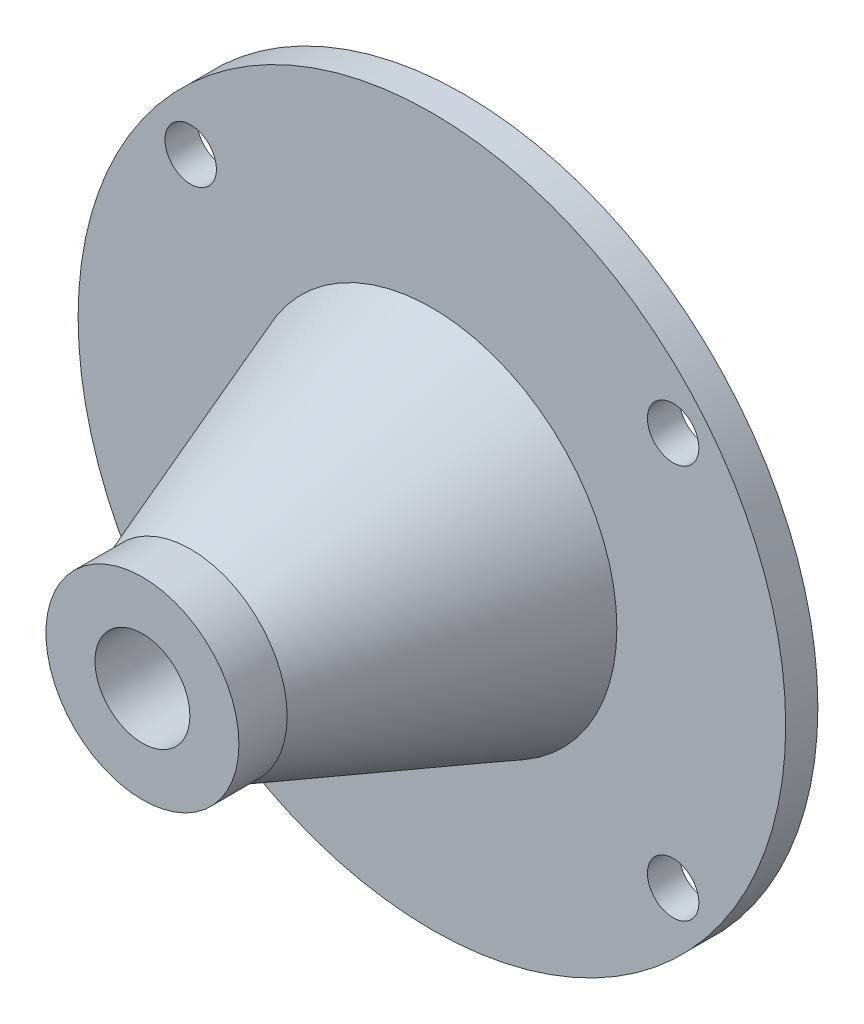
ISO-10303-21;
HEADER;
FILE_DESCRIPTION(('STEP AP214'),'2;1');
FILE_NAME('part.step','',(''),(''),'','','');
FILE_SCHEMA(('AUTOMOTIVE_DESIGN { 1 0 10303 214 1 1 1 1 }'));
ENDSEC;
DATA;
#1=APPLICATION_CONTEXT('core data for automotive mechanical design processes');
#2=APPLICATION_PROTOCOL_DEFINITION('international standard','automotive_design',2000,#1);
#3=PRODUCT_CONTEXT('',#1,'mechanical');
#4=PRODUCT('Part','Part','',(#3));
#5=PRODUCT_RELATED_PRODUCT_CATEGORY('part','',(#4));
#6=PRODUCT_DEFINITION_FORMATION('','',#4);
#7=PRODUCT_DEFINITION_CONTEXT('part definition',#1,'design');
#8=PRODUCT_DEFINITION('design','',#6,#7);
#9=PRODUCT_DEFINITION_SHAPE('','',#8);
#10=(LENGTH_UNIT() NAMED_UNIT(*) SI_UNIT(.MILLI.,.METRE.));
#11=(NAMED_UNIT(*) PLANE_ANGLE_UNIT() SI_UNIT($,.RADIAN.));
#12=(NAMED_UNIT(*) SI_UNIT($,.STERADIAN.) SOLID_ANGLE_UNIT());
#13=UNCERTAINTY_MEASURE_WITH_UNIT(LENGTH_MEASURE(1.E-05),#10,'distance_accuracy_value','');
#14=(GEOMETRIC_REPRESENTATION_CONTEXT(3) GLOBAL_UNCERTAINTY_ASSIGNED_CONTEXT((#13)) GLOBAL_UNIT_ASSIGNED_CONTEXT((#10,
#11,#12)) REPRESENTATION_CONTEXT('',''));
#15=CARTESIAN_POINT('',(0.,0.,0.));
#16=DIRECTION('',(0.,0.,1.));
#17=DIRECTION('',(1.,0.,0.));
#18=AXIS2_PLACEMENT_3D('',#15,#16,#17);
#19=CARTESIAN_POINT('',(0.,0.,2.));
#20=DIRECTION('',(0.,0.,1.));
#21=DIRECTION('',(1.,0.,0.));
#22=AXIS2_PLACEMENT_3D('',#19,#20,#21);
#23=PLANE('',#22);
#24=CARTESIAN_POINT('',(0.,0.,2.));
#25=DIRECTION('',(0.,0.,1.));
#26=DIRECTION('',(1.,0.,0.));
#27=AXIS2_PLACEMENT_3D('',#24,#25,#26);
#28=CIRCLE('',#27,2.95);
#29=CARTESIAN_POINT('',(2.95,0.,2.));
#30=VERTEX_POINT('',#29);
#31=EDGE_CURVE('E17',#30,#30,#28,.T.);
#32=ORIENTED_EDGE('',*,*,#31,.T.);
#33=EDGE_LOOP('',(#32));
#34=FACE_BOUND('',#33,.T.);
#35=ADVANCED_FACE('F14',(#34),#23,.T.);
#36=CARTESIAN_POINT('',(0.,0.,2.));
#37=DIRECTION('',(0.,0.,1.));
#38=DIRECTION('',(1.,0.,0.));
#39=AXIS2_PLACEMENT_3D('',#36,#37,#38);
#40=CYLINDRICAL_SURFACE('',#39,2.95);
#41=CARTESIAN_POINT('',(0.,0.,20.));
#42=DIRECTION('',(0.,0.,1.));
#43=DIRECTION('',(1.,0.,0.));
#44=AXIS2_PLACEMENT_3D('',#41,#42,#43);
#45=CIRCLE('',#44,2.95);
#46=CARTESIAN_POINT('',(2.95,0.,20.));
#47=VERTEX_POINT('',#46);
#48=EDGE_CURVE('E59',#47,#47,#45,.F.);
#49=ORIENTED_EDGE('',*,*,#48,.F.);
#50=EDGE_LOOP('',(#49));
#51=FACE_BOUND('',#50,.T.);
#52=ORIENTED_EDGE('',*,*,#31,.F.);
#53=EDGE_LOOP('',(#52));
#54=FACE_BOUND('',#53,.T.);
#55=ADVANCED_FACE('F67',(#51,#54),#40,.F.);
#56=CARTESIAN_POINT('',(0.,0.,20.));
#57=DIRECTION('',(0.,0.,1.));
#58=DIRECTION('',(1.,0.,0.));
#59=AXIS2_PLACEMENT_3D('',#56,#57,#58);
#60=PLANE('',#59);
#61=ORIENTED_EDGE('',*,*,#48,.T.);
#62=EDGE_LOOP('',(#61));
#63=FACE_BOUND('',#62,.T.);
#64=CARTESIAN_POINT('',(0.,0.,20.));
#65=DIRECTION('',(0.,0.,1.));
#66=DIRECTION('',(1.,0.,0.));
#67=AXIS2_PLACEMENT_3D('',#64,#65,#66);
#68=CIRCLE('',#67,6.);
#69=CARTESIAN_POINT('',(6.,0.,20.));
#70=VERTEX_POINT('',#69);
#71=EDGE_CURVE('E57',#70,#70,#68,.F.);
#72=ORIENTED_EDGE('',*,*,#71,.F.);
#73=EDGE_LOOP('',(#72));
#74=FACE_BOUND('',#73,.T.);
#75=ADVANCED_FACE('F69',(#63,#74),#60,.T.);
#76=CARTESIAN_POINT('',(0.,0.,2.));
#77=DIRECTION('',(0.,0.,1.));
#78=DIRECTION('',(1.,0.,0.));
#79=AXIS2_PLACEMENT_3D('',#76,#77,#78);
#80=CYLINDRICAL_SURFACE('',#79,6.);
#81=ORIENTED_EDGE('',*,*,#71,.T.);
#82=EDGE_LOOP('',(#81));
#83=FACE_BOUND('',#82,.T.);
#84=CARTESIAN_POINT('',(0.,0.,17.0000000000528));
#85=DIRECTION('',(0.,0.,-1.));
#86=DIRECTION('',(-1.,0.,0.));
#87=AXIS2_PLACEMENT_3D('',#84,#85,#86);
#88=CIRCLE('',#87,6.00000000002865);
#89=CARTESIAN_POINT('',(-6.00000000002865,0.,17.0000000000528));
#90=VERTEX_POINT('',#89);
#91=EDGE_CURVE('E29',#90,#90,#88,.T.);
#92=ORIENTED_EDGE('',*,*,#91,.F.);
#93=EDGE_LOOP('',(#92));
#94=FACE_BOUND('',#93,.T.);
#95=ADVANCED_FACE('F76',(#83,#94),#80,.T.);
#96=CARTESIAN_POINT('',(0.,0.,2.00000000012324));
#97=DIRECTION('',(0.,0.,-1.));
#98=DIRECTION('',(-1.,0.,0.));
#99=AXIS2_PLACEMENT_3D('',#96,#97,#98);
#100=CONICAL_SURFACE('',#99,11.4999999999839,0.351444794003774);
#101=ORIENTED_EDGE('',*,*,#91,.T.);
#102=EDGE_LOOP('',(#101));
#103=FACE_BOUND('',#102,.T.);
#104=CARTESIAN_POINT('',(0.,0.,2.00000000000955));
#105=DIRECTION('',(0.,0.,-1.));
#106=DIRECTION('',(-1.,0.,0.));
#107=AXIS2_PLACEMENT_3D('',#104,#105,#106);
#108=CIRCLE('',#107,11.5000000000255);
#109=CARTESIAN_POINT('',(-11.5000000000255,0.,2.00000000000955));
#110=VERTEX_POINT('',#109);
#111=EDGE_CURVE('E54',#110,#110,#108,.T.);
#112=ORIENTED_EDGE('',*,*,#111,.F.);
#113=EDGE_LOOP('',(#112));
#114=FACE_BOUND('',#113,.T.);
#115=ADVANCED_FACE('F109',(#103,#114),#100,.T.);
#116=CARTESIAN_POINT('',(0.,0.,2.));
#117=DIRECTION('',(0.,0.,1.));
#118=DIRECTION('',(1.,0.,0.));
#119=AXIS2_PLACEMENT_3D('',#116,#117,#118);
#120=PLANE('',#119);
#121=ORIENTED_EDGE('',*,*,#111,.T.);
#122=EDGE_LOOP('',(#121));
#123=FACE_BOUND('',#122,.T.);
#124=CARTESIAN_POINT('',(-15.,-12.25,2.));
#125=DIRECTION('',(0.,0.,1.));
#126=DIRECTION('',(1.,0.,0.));
#127=AXIS2_PLACEMENT_3D('',#124,#125,#126);
#128=CIRCLE('',#127,1.6);
#129=CARTESIAN_POINT('',(-13.4,-12.25,2.));
#130=VERTEX_POINT('',#129);
#131=EDGE_CURVE('E39',#130,#130,#128,.F.);
#132=ORIENTED_EDGE('',*,*,#131,.T.);
#133=EDGE_LOOP('',(#132));
#134=FACE_BOUND('',#133,.T.);
#135=CARTESIAN_POINT('',(15.,-12.25,2.));
#136=DIRECTION('',(0.,0.,1.));
#137=DIRECTION('',(1.,0.,0.));
#138=AXIS2_PLACEMENT_3D('',#135,#136,#137);
#139=CIRCLE('',#138,1.6);
#140=CARTESIAN_POINT('',(16.6,-12.25,2.));
#141=VERTEX_POINT('',#140);
#142=EDGE_CURVE('E42',#141,#141,#139,.F.);
#143=ORIENTED_EDGE('',*,*,#142,.T.);
#144=EDGE_LOOP('',(#143));
#145=FACE_BOUND('',#144,.T.);
#146=CARTESIAN_POINT('',(15.,12.25,2.));
#147=DIRECTION('',(0.,0.,1.));
#148=DIRECTION('',(1.,0.,0.));
#149=AXIS2_PLACEMENT_3D('',#146,#147,#148);
#150=CIRCLE('',#149,1.6);
#151=CARTESIAN_POINT('',(16.6,12.25,2.));
#152=VERTEX_POINT('',#151);
#153=EDGE_CURVE('E45',#152,#152,#150,.F.);
#154=ORIENTED_EDGE('',*,*,#153,.T.);
#155=EDGE_LOOP('',(#154));
#156=FACE_BOUND('',#155,.T.);
#157=CARTESIAN_POINT('',(-15.,12.25,2.));
#158=DIRECTION('',(0.,0.,1.));
#159=DIRECTION('',(1.,0.,0.));
#160=AXIS2_PLACEMENT_3D('',#157,#158,#159);
#161=CIRCLE('',#160,1.6);
#162=CARTESIAN_POINT('',(-13.4,12.25,2.));
#163=VERTEX_POINT('',#162);
#164=EDGE_CURVE('E48',#163,#163,#161,.F.);
#165=ORIENTED_EDGE('',*,*,#164,.T.);
#166=EDGE_LOOP('',(#165));
#167=FACE_BOUND('',#166,.T.);
#168=CARTESIAN_POINT('',(0.,0.,2.));
#169=DIRECTION('',(0.,0.,1.));
#170=DIRECTION('',(1.,0.,0.));
#171=AXIS2_PLACEMENT_3D('',#168,#169,#170);
#172=CIRCLE('',#171,22.);
#173=CARTESIAN_POINT('',(22.,0.,2.));
#174=VERTEX_POINT('',#173);
#175=EDGE_CURVE('E51',#174,#174,#172,.F.);
#176=ORIENTED_EDGE('',*,*,#175,.F.);
#177=EDGE_LOOP('',(#176));
#178=FACE_BOUND('',#177,.T.);
#179=ADVANCED_FACE('F105',(#123,#134,#145,#156,#167,#178),#120,.T.);
#180=CARTESIAN_POINT('',(0.,0.,0.));
#181=DIRECTION('',(0.,0.,1.));
#182=DIRECTION('',(1.,0.,0.));
#183=AXIS2_PLACEMENT_3D('',#180,#181,#182);
#184=CYLINDRICAL_SURFACE('',#183,22.);
#185=ORIENTED_EDGE('',*,*,#175,.T.);
#186=EDGE_LOOP('',(#185));
#187=FACE_BOUND('',#186,.T.);
#188=CARTESIAN_POINT('',(0.,0.,0.));
#189=DIRECTION('',(0.,0.,1.));
#190=DIRECTION('',(1.,0.,0.));
#191=AXIS2_PLACEMENT_3D('',#188,#189,#190);
#192=CIRCLE('',#191,22.);
#193=CARTESIAN_POINT('',(22.,0.,0.));
#194=VERTEX_POINT('',#193);
#195=EDGE_CURVE('E36',#194,#194,#192,.T.);
#196=ORIENTED_EDGE('',*,*,#195,.T.);
#197=EDGE_LOOP('',(#196));
#198=FACE_BOUND('',#197,.T.);
#199=ADVANCED_FACE('F101',(#187,#198),#184,.T.);
#200=CARTESIAN_POINT('',(-15.,12.25,0.));
#201=DIRECTION('',(0.,0.,1.));
#202=DIRECTION('',(1.,0.,0.));
#203=AXIS2_PLACEMENT_3D('',#200,#201,#202);
#204=CYLINDRICAL_SURFACE('',#203,1.6);
#205=ORIENTED_EDGE('',*,*,#164,.F.);
#206=EDGE_LOOP('',(#205));
#207=FACE_BOUND('',#206,.T.);
#208=CARTESIAN_POINT('',(-15.,12.25,0.));
#209=DIRECTION('',(0.,0.,1.));
#210=DIRECTION('',(1.,0.,0.));
#211=AXIS2_PLACEMENT_3D('',#208,#209,#210);
#212=CIRCLE('',#211,1.6);
#213=CARTESIAN_POINT('',(-13.4,12.25,0.));
#214=VERTEX_POINT('',#213);
#215=EDGE_CURVE('E33',#214,#214,#212,.F.);
#216=ORIENTED_EDGE('',*,*,#215,.T.);
#217=EDGE_LOOP('',(#216));
#218=FACE_BOUND('',#217,.T.);
#219=ADVANCED_FACE('F97',(#207,#218),#204,.F.);
#220=CARTESIAN_POINT('',(15.,12.25,0.));
#221=DIRECTION('',(0.,0.,1.));
#222=DIRECTION('',(1.,0.,0.));
#223=AXIS2_PLACEMENT_3D('',#220,#221,#222);
#224=CYLINDRICAL_SURFACE('',#223,1.6);
#225=ORIENTED_EDGE('',*,*,#153,.F.);
#226=EDGE_LOOP('',(#225));
#227=FACE_BOUND('',#226,.T.);
#228=CARTESIAN_POINT('',(15.,12.25,0.));
#229=DIRECTION('',(0.,0.,1.));
#230=DIRECTION('',(1.,0.,0.));
#231=AXIS2_PLACEMENT_3D('',#228,#229,#230);
#232=CIRCLE('',#231,1.6);
#233=CARTESIAN_POINT('',(16.6,12.25,0.));
#234=VERTEX_POINT('',#233);
#235=EDGE_CURVE('E26',#234,#234,#232,.F.);
#236=ORIENTED_EDGE('',*,*,#235,.T.);
#237=EDGE_LOOP('',(#236));
#238=FACE_BOUND('',#237,.T.);
#239=ADVANCED_FACE('F93',(#227,#238),#224,.F.);
#240=CARTESIAN_POINT('',(15.,-12.25,0.));
#241=DIRECTION('',(0.,0.,1.));
#242=DIRECTION('',(1.,0.,0.));
#243=AXIS2_PLACEMENT_3D('',#240,#241,#242);
#244=CYLINDRICAL_SURFACE('',#243,1.6);
#245=ORIENTED_EDGE('',*,*,#142,.F.);
#246=EDGE_LOOP('',(#245));
#247=FACE_BOUND('',#246,.T.);
#248=CARTESIAN_POINT('',(15.,-12.25,0.));
#249=DIRECTION('',(0.,0.,1.));
#250=DIRECTION('',(1.,0.,0.));
#251=AXIS2_PLACEMENT_3D('',#248,#249,#250);
#252=CIRCLE('',#251,1.6);
#253=CARTESIAN_POINT('',(16.6,-12.25,0.));
#254=VERTEX_POINT('',#253);
#255=EDGE_CURVE('E21',#254,#254,#252,.F.);
#256=ORIENTED_EDGE('',*,*,#255,.T.);
#257=EDGE_LOOP('',(#256));
#258=FACE_BOUND('',#257,.T.);
#259=ADVANCED_FACE('F86',(#247,#258),#244,.F.);
#260=CARTESIAN_POINT('',(-15.,-12.25,0.));
#261=DIRECTION('',(0.,0.,1.));
#262=DIRECTION('',(1.,0.,0.));
#263=AXIS2_PLACEMENT_3D('',#260,#261,#262);
#264=CYLINDRICAL_SURFACE('',#263,1.6);
#265=ORIENTED_EDGE('',*,*,#131,.F.);
#266=EDGE_LOOP('',(#265));
#267=FACE_BOUND('',#266,.T.);
#268=CARTESIAN_POINT('',(-15.,-12.25,0.));
#269=DIRECTION('',(0.,0.,1.));
#270=DIRECTION('',(1.,0.,0.));
#271=AXIS2_PLACEMENT_3D('',#268,#269,#270);
#272=CIRCLE('',#271,1.6);
#273=CARTESIAN_POINT('',(-13.4,-12.25,0.));
#274=VERTEX_POINT('',#273);
#275=EDGE_CURVE('E9',#274,#274,#272,.F.);
#276=ORIENTED_EDGE('',*,*,#275,.T.);
#277=EDGE_LOOP('',(#276));
#278=FACE_BOUND('',#277,.T.);
#279=ADVANCED_FACE('F80',(#267,#278),#264,.F.);
#280=CARTESIAN_POINT('',(0.,0.,0.));
#281=DIRECTION('',(0.,0.,1.));
#282=DIRECTION('',(1.,0.,0.));
#283=AXIS2_PLACEMENT_3D('',#280,#281,#282);
#284=PLANE('',#283);
#285=ORIENTED_EDGE('',*,*,#275,.F.);
#286=EDGE_LOOP('',(#285));
#287=FACE_BOUND('',#286,.T.);
#288=ORIENTED_EDGE('',*,*,#255,.F.);
#289=EDGE_LOOP('',(#288));
#290=FACE_BOUND('',#289,.T.);
#291=ORIENTED_EDGE('',*,*,#235,.F.);
#292=EDGE_LOOP('',(#291));
#293=FACE_BOUND('',#292,.T.);
#294=ORIENTED_EDGE('',*,*,#215,.F.);
#295=EDGE_LOOP('',(#294));
#296=FACE_BOUND('',#295,.T.);
#297=ORIENTED_EDGE('',*,*,#195,.F.);
#298=EDGE_LOOP('',(#297));
#299=FACE_BOUND('',#298,.T.);
#300=ADVANCED_FACE('F78',(#287,#290,#293,#296,#299),#284,.F.);
#301=CLOSED_SHELL('',(#35,#55,#75,#95,#115,#179,#199,#219,#239,#259,#279,#300));
#302=MANIFOLD_SOLID_BREP('B1',#301);
#303=ADVANCED_BREP_SHAPE_REPRESENTATION('',(#18,#302),#14);
#304=SHAPE_DEFINITION_REPRESENTATION(#9,#303);
ENDSEC;
END-ISO-10303-21;
